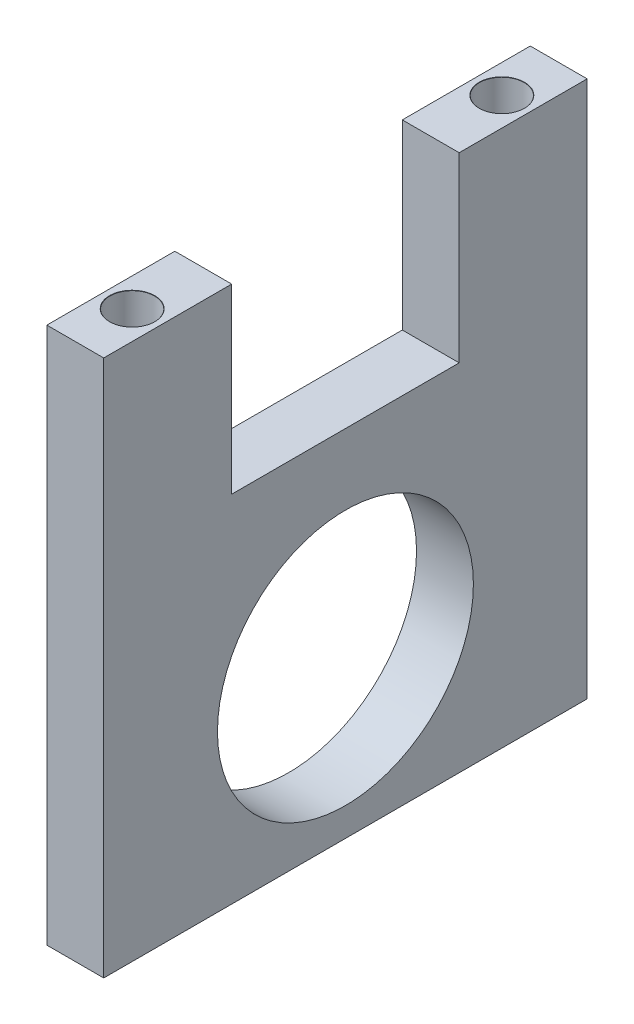
ISO-10303-21;
HEADER;
FILE_DESCRIPTION(('STEP AP214'),'2;1');
FILE_NAME('part.step','',(''),(''),'','','');
FILE_SCHEMA(('AUTOMOTIVE_DESIGN { 1 0 10303 214 1 1 1 1 }'));
ENDSEC;
DATA;
#1=APPLICATION_CONTEXT('core data for automotive mechanical design processes');
#2=APPLICATION_PROTOCOL_DEFINITION('international standard','automotive_design',2000,#1);
#3=PRODUCT_CONTEXT('',#1,'mechanical');
#4=PRODUCT('Part','Part','',(#3));
#5=PRODUCT_RELATED_PRODUCT_CATEGORY('part','',(#4));
#6=PRODUCT_DEFINITION_FORMATION('','',#4);
#7=PRODUCT_DEFINITION_CONTEXT('part definition',#1,'design');
#8=PRODUCT_DEFINITION('design','',#6,#7);
#9=PRODUCT_DEFINITION_SHAPE('','',#8);
#10=(LENGTH_UNIT() NAMED_UNIT(*) SI_UNIT(.MILLI.,.METRE.));
#11=(NAMED_UNIT(*) PLANE_ANGLE_UNIT() SI_UNIT($,.RADIAN.));
#12=(NAMED_UNIT(*) SI_UNIT($,.STERADIAN.) SOLID_ANGLE_UNIT());
#13=UNCERTAINTY_MEASURE_WITH_UNIT(LENGTH_MEASURE(1.E-05),#10,'distance_accuracy_value','');
#14=(GEOMETRIC_REPRESENTATION_CONTEXT(3) GLOBAL_UNCERTAINTY_ASSIGNED_CONTEXT((#13)) GLOBAL_UNIT_ASSIGNED_CONTEXT((#10,
#11,#12)) REPRESENTATION_CONTEXT('',''));
#15=CARTESIAN_POINT('',(0.,0.,0.));
#16=DIRECTION('',(0.,0.,1.));
#17=DIRECTION('',(1.,0.,0.));
#18=AXIS2_PLACEMENT_3D('',#15,#16,#17);
#19=CARTESIAN_POINT('',(163.908317581196,76.2,0.));
#20=DIRECTION('',(0.,-1.,0.));
#21=DIRECTION('',(0.,0.,-1.));
#22=AXIS2_PLACEMENT_3D('',#19,#20,#21);
#23=PLANE('',#22);
#24=DIRECTION('',(0.,0.,-1.));
#25=VECTOR('',#24,1.);
#26=CARTESIAN_POINT('',(170.258317581196,76.2,0.));
#27=LINE('',#26,#25);
#28=CARTESIAN_POINT('',(170.258317581196,76.2,-88.9));
#29=VERTEX_POINT('',#28);
#30=CARTESIAN_POINT('',(170.258317581196,76.2,-114.3));
#31=VERTEX_POINT('',#30);
#32=EDGE_CURVE('E242',#29,#31,#27,.T.);
#33=ORIENTED_EDGE('',*,*,#32,.T.);
#34=DIRECTION('',(1.,0.,0.));
#35=VECTOR('',#34,1.);
#36=CARTESIAN_POINT('',(163.908317581196,76.2,-114.3));
#37=LINE('',#36,#35);
#38=CARTESIAN_POINT('',(163.908317581196,76.2,-114.3));
#39=VERTEX_POINT('',#38);
#40=EDGE_CURVE('E11',#39,#31,#37,.T.);
#41=ORIENTED_EDGE('',*,*,#40,.F.);
#42=DIRECTION('',(0.,0.,-1.));
#43=VECTOR('',#42,1.);
#44=CARTESIAN_POINT('',(163.908317581196,76.2,0.));
#45=LINE('',#44,#43);
#46=CARTESIAN_POINT('',(163.908317581196,76.2,-88.9));
#47=VERTEX_POINT('',#46);
#48=EDGE_CURVE('E68',#47,#39,#45,.T.);
#49=ORIENTED_EDGE('',*,*,#48,.F.);
#50=DIRECTION('',(1.,0.,0.));
#51=VECTOR('',#50,1.);
#52=CARTESIAN_POINT('',(163.908317581196,76.2,-88.9));
#53=LINE('',#52,#51);
#54=EDGE_CURVE('E53',#47,#29,#53,.T.);
#55=ORIENTED_EDGE('',*,*,#54,.T.);
#56=EDGE_LOOP('',(#33,#41,#49,#55));
#57=FACE_BOUND('',#56,.T.);
#58=ADVANCED_FACE('F49',(#57),#23,.F.);
#59=CARTESIAN_POINT('',(163.908317581196,0.,-114.3));
#60=DIRECTION('',(0.,0.,1.));
#61=DIRECTION('',(1.,0.,0.));
#62=AXIS2_PLACEMENT_3D('',#59,#60,#61);
#63=PLANE('',#62);
#64=DIRECTION('',(0.,-1.,0.));
#65=VECTOR('',#64,1.);
#66=CARTESIAN_POINT('',(170.258317581196,0.,-114.3));
#67=LINE('',#66,#65);
#68=CARTESIAN_POINT('',(170.258317581196,96.52,-114.3));
#69=VERTEX_POINT('',#68);
#70=EDGE_CURVE('E157',#69,#31,#67,.T.);
#71=ORIENTED_EDGE('',*,*,#70,.F.);
#72=DIRECTION('',(1.,0.,0.));
#73=VECTOR('',#72,1.);
#74=CARTESIAN_POINT('',(163.908317581196,96.52,-114.3));
#75=LINE('',#74,#73);
#76=CARTESIAN_POINT('',(163.908317581196,96.52,-114.3));
#77=VERTEX_POINT('',#76);
#78=EDGE_CURVE('E59',#77,#69,#75,.T.);
#79=ORIENTED_EDGE('',*,*,#78,.F.);
#80=DIRECTION('',(0.,-1.,0.));
#81=VECTOR('',#80,1.);
#82=CARTESIAN_POINT('',(163.908317581196,0.,-114.3));
#83=LINE('',#82,#81);
#84=EDGE_CURVE('E142',#77,#39,#83,.T.);
#85=ORIENTED_EDGE('',*,*,#84,.T.);
#86=ORIENTED_EDGE('',*,*,#40,.T.);
#87=EDGE_LOOP('',(#71,#79,#85,#86));
#88=FACE_BOUND('',#87,.T.);
#89=ADVANCED_FACE('F181',(#88),#63,.T.);
#90=CARTESIAN_POINT('',(163.908317581196,96.52,0.));
#91=DIRECTION('',(0.,1.,0.));
#92=DIRECTION('',(0.,0.,1.));
#93=AXIS2_PLACEMENT_3D('',#90,#91,#92);
#94=PLANE('',#93);
#95=CARTESIAN_POINT('',(167.083317581196,96.52,-122.2375));
#96=DIRECTION('',(0.,1.,0.));
#97=DIRECTION('',(0.,0.,1.));
#98=AXIS2_PLACEMENT_3D('',#95,#96,#97);
#99=CIRCLE('',#98,2.525);
#100=CARTESIAN_POINT('',(167.083317581196,96.52,-119.7125));
#101=VERTEX_POINT('',#100);
#102=EDGE_CURVE('E174',#101,#101,#99,.T.);
#103=ORIENTED_EDGE('',*,*,#102,.F.);
#104=EDGE_LOOP('',(#103));
#105=FACE_BOUND('',#104,.T.);
#106=DIRECTION('',(0.,0.,1.));
#107=VECTOR('',#106,1.);
#108=CARTESIAN_POINT('',(170.258317581196,96.52,0.));
#109=LINE('',#108,#107);
#110=CARTESIAN_POINT('',(170.258317581196,96.52,-128.5875));
#111=VERTEX_POINT('',#110);
#112=EDGE_CURVE('E129',#111,#69,#109,.T.);
#113=ORIENTED_EDGE('',*,*,#112,.F.);
#114=DIRECTION('',(1.,0.,0.));
#115=VECTOR('',#114,1.);
#116=CARTESIAN_POINT('',(163.908317581196,96.52,-128.5875));
#117=LINE('',#116,#115);
#118=CARTESIAN_POINT('',(163.908317581196,96.52,-128.5875));
#119=VERTEX_POINT('',#118);
#120=EDGE_CURVE('E124',#119,#111,#117,.T.);
#121=ORIENTED_EDGE('',*,*,#120,.F.);
#122=DIRECTION('',(0.,0.,1.));
#123=VECTOR('',#122,1.);
#124=CARTESIAN_POINT('',(163.908317581196,96.52,0.));
#125=LINE('',#124,#123);
#126=EDGE_CURVE('E128',#119,#77,#125,.T.);
#127=ORIENTED_EDGE('',*,*,#126,.T.);
#128=ORIENTED_EDGE('',*,*,#78,.T.);
#129=EDGE_LOOP('',(#113,#121,#127,#128));
#130=FACE_BOUND('',#129,.T.);
#131=ADVANCED_FACE('F126',(#105,#130),#94,.T.);
#132=CARTESIAN_POINT('',(163.908317581196,0.,-128.5875));
#133=DIRECTION('',(0.,0.,1.));
#134=DIRECTION('',(1.,0.,0.));
#135=AXIS2_PLACEMENT_3D('',#132,#133,#134);
#136=PLANE('',#135);
#137=DIRECTION('',(0.,-1.,0.));
#138=VECTOR('',#137,1.);
#139=CARTESIAN_POINT('',(170.258317581196,0.,-128.5875));
#140=LINE('',#139,#138);
#141=CARTESIAN_POINT('',(170.258317581196,36.5632999999999,-128.5875));
#142=VERTEX_POINT('',#141);
#143=EDGE_CURVE('E218',#111,#142,#140,.T.);
#144=ORIENTED_EDGE('',*,*,#143,.T.);
#145=DIRECTION('',(1.,0.,0.));
#146=VECTOR('',#145,1.);
#147=CARTESIAN_POINT('',(163.908317581196,36.5632999999999,-128.5875));
#148=LINE('',#147,#146);
#149=CARTESIAN_POINT('',(163.908317581196,36.5632999999999,-128.5875));
#150=VERTEX_POINT('',#149);
#151=EDGE_CURVE('E132',#150,#142,#148,.T.);
#152=ORIENTED_EDGE('',*,*,#151,.F.);
#153=DIRECTION('',(0.,-1.,0.));
#154=VECTOR('',#153,1.);
#155=CARTESIAN_POINT('',(163.908317581196,0.,-128.5875));
#156=LINE('',#155,#154);
#157=EDGE_CURVE('E135',#119,#150,#156,.T.);
#158=ORIENTED_EDGE('',*,*,#157,.F.);
#159=ORIENTED_EDGE('',*,*,#120,.T.);
#160=EDGE_LOOP('',(#144,#152,#158,#159));
#161=FACE_BOUND('',#160,.T.);
#162=ADVANCED_FACE('F136',(#161),#136,.F.);
#163=CARTESIAN_POINT('',(163.908317581196,36.5632999999999,0.));
#164=DIRECTION('',(0.,1.,0.));
#165=DIRECTION('',(0.,0.,1.));
#166=AXIS2_PLACEMENT_3D('',#163,#164,#165);
#167=PLANE('',#166);
#168=DIRECTION('',(0.,0.,1.));
#169=VECTOR('',#168,1.);
#170=CARTESIAN_POINT('',(170.258317581196,36.5632999999999,0.));
#171=LINE('',#170,#169);
#172=CARTESIAN_POINT('',(170.258317581196,36.5632999999999,-74.6125));
#173=VERTEX_POINT('',#172);
#174=EDGE_CURVE('E214',#142,#173,#171,.T.);
#175=ORIENTED_EDGE('',*,*,#174,.T.);
#176=DIRECTION('',(1.,0.,0.));
#177=VECTOR('',#176,1.);
#178=CARTESIAN_POINT('',(163.908317581196,36.5632999999999,-74.6125));
#179=LINE('',#178,#177);
#180=CARTESIAN_POINT('',(163.908317581196,36.5632999999999,-74.6125));
#181=VERTEX_POINT('',#180);
#182=EDGE_CURVE('E216',#181,#173,#179,.T.);
#183=ORIENTED_EDGE('',*,*,#182,.F.);
#184=DIRECTION('',(0.,0.,1.));
#185=VECTOR('',#184,1.);
#186=CARTESIAN_POINT('',(163.908317581196,36.5632999999999,0.));
#187=LINE('',#186,#185);
#188=EDGE_CURVE('E139',#150,#181,#187,.T.);
#189=ORIENTED_EDGE('',*,*,#188,.F.);
#190=ORIENTED_EDGE('',*,*,#151,.T.);
#191=EDGE_LOOP('',(#175,#183,#189,#190));
#192=FACE_BOUND('',#191,.T.);
#193=ADVANCED_FACE('F189',(#192),#167,.F.);
#194=CARTESIAN_POINT('',(163.908317581196,0.,-74.6125));
#195=DIRECTION('',(0.,0.,1.));
#196=DIRECTION('',(1.,0.,0.));
#197=AXIS2_PLACEMENT_3D('',#194,#195,#196);
#198=PLANE('',#197);
#199=DIRECTION('',(0.,-1.,0.));
#200=VECTOR('',#199,1.);
#201=CARTESIAN_POINT('',(170.258317581196,0.,-74.6125));
#202=LINE('',#201,#200);
#203=CARTESIAN_POINT('',(170.258317581196,96.52,-74.6125));
#204=VERTEX_POINT('',#203);
#205=EDGE_CURVE('E219',#204,#173,#202,.T.);
#206=ORIENTED_EDGE('',*,*,#205,.F.);
#207=DIRECTION('',(1.,0.,0.));
#208=VECTOR('',#207,1.);
#209=CARTESIAN_POINT('',(163.908317581196,96.52,-74.6125));
#210=LINE('',#209,#208);
#211=CARTESIAN_POINT('',(163.908317581196,96.52,-74.6125));
#212=VERTEX_POINT('',#211);
#213=EDGE_CURVE('E239',#212,#204,#210,.T.);
#214=ORIENTED_EDGE('',*,*,#213,.F.);
#215=DIRECTION('',(0.,-1.,0.));
#216=VECTOR('',#215,1.);
#217=CARTESIAN_POINT('',(163.908317581196,0.,-74.6125));
#218=LINE('',#217,#216);
#219=EDGE_CURVE('E149',#212,#181,#218,.T.);
#220=ORIENTED_EDGE('',*,*,#219,.T.);
#221=ORIENTED_EDGE('',*,*,#182,.T.);
#222=EDGE_LOOP('',(#206,#214,#220,#221));
#223=FACE_BOUND('',#222,.T.);
#224=ADVANCED_FACE('F193',(#223),#198,.T.);
#225=CARTESIAN_POINT('',(167.083317581196,96.52,-80.9625));
#226=DIRECTION('',(0.,1.,0.));
#227=DIRECTION('',(0.,0.,1.));
#228=AXIS2_PLACEMENT_3D('',#225,#226,#227);
#229=CIRCLE('',#228,2.525);
#230=CARTESIAN_POINT('',(167.083317581196,96.52,-78.4375));
#231=VERTEX_POINT('',#230);
#232=EDGE_CURVE('E165',#231,#231,#229,.T.);
#233=ORIENTED_EDGE('',*,*,#232,.F.);
#234=EDGE_LOOP('',(#233));
#235=FACE_BOUND('',#234,.T.);
#236=CARTESIAN_POINT('',(170.258317581196,96.52,-88.9));
#237=VERTEX_POINT('',#236);
#238=EDGE_CURVE('E227',#237,#204,#109,.T.);
#239=ORIENTED_EDGE('',*,*,#238,.F.);
#240=DIRECTION('',(1.,0.,0.));
#241=VECTOR('',#240,1.);
#242=CARTESIAN_POINT('',(163.908317581196,96.52,-88.9));
#243=LINE('',#242,#241);
#244=CARTESIAN_POINT('',(163.908317581196,96.52,-88.9));
#245=VERTEX_POINT('',#244);
#246=EDGE_CURVE('E240',#245,#237,#243,.T.);
#247=ORIENTED_EDGE('',*,*,#246,.F.);
#248=EDGE_CURVE('E144',#245,#212,#125,.T.);
#249=ORIENTED_EDGE('',*,*,#248,.T.);
#250=ORIENTED_EDGE('',*,*,#213,.T.);
#251=EDGE_LOOP('',(#239,#247,#249,#250));
#252=FACE_BOUND('',#251,.T.);
#253=ADVANCED_FACE('F183',(#235,#252),#94,.T.);
#254=CARTESIAN_POINT('',(163.908317581196,54.0257999999999,-101.6));
#255=DIRECTION('',(1.,0.,0.));
#256=DIRECTION('',(0.,0.,-1.));
#257=AXIS2_PLACEMENT_3D('',#254,#255,#256);
#258=CYLINDRICAL_SURFACE('',#257,14.2875);
#259=CARTESIAN_POINT('',(163.908317581196,54.0257999999999,-101.6));
#260=DIRECTION('',(1.,0.,0.));
#261=DIRECTION('',(0.,0.,-1.));
#262=AXIS2_PLACEMENT_3D('',#259,#260,#261);
#263=CIRCLE('',#262,14.2875);
#264=CARTESIAN_POINT('',(163.908317581196,54.0257999999999,-115.8875));
#265=VERTEX_POINT('',#264);
#266=EDGE_CURVE('E152',#265,#265,#263,.T.);
#267=ORIENTED_EDGE('',*,*,#266,.F.);
#268=EDGE_LOOP('',(#267));
#269=FACE_BOUND('',#268,.T.);
#270=CARTESIAN_POINT('',(170.258317581196,54.0257999999999,-101.6));
#271=DIRECTION('',(1.,0.,0.));
#272=DIRECTION('',(0.,0.,-1.));
#273=AXIS2_PLACEMENT_3D('',#270,#271,#272);
#274=CIRCLE('',#273,14.2875);
#275=CARTESIAN_POINT('',(170.258317581196,54.0257999999999,-115.8875));
#276=VERTEX_POINT('',#275);
#277=EDGE_CURVE('E161',#276,#276,#274,.T.);
#278=ORIENTED_EDGE('',*,*,#277,.T.);
#279=EDGE_LOOP('',(#278));
#280=FACE_BOUND('',#279,.T.);
#281=ADVANCED_FACE('F51',(#269,#280),#258,.F.);
#282=CARTESIAN_POINT('',(163.908317581196,0.,-88.9));
#283=DIRECTION('',(0.,0.,1.));
#284=DIRECTION('',(1.,0.,0.));
#285=AXIS2_PLACEMENT_3D('',#282,#283,#284);
#286=PLANE('',#285);
#287=DIRECTION('',(0.,-1.,0.));
#288=VECTOR('',#287,1.);
#289=CARTESIAN_POINT('',(170.258317581196,0.,-88.9));
#290=LINE('',#289,#288);
#291=EDGE_CURVE('E229',#237,#29,#290,.T.);
#292=ORIENTED_EDGE('',*,*,#291,.T.);
#293=ORIENTED_EDGE('',*,*,#54,.F.);
#294=DIRECTION('',(0.,-1.,0.));
#295=VECTOR('',#294,1.);
#296=CARTESIAN_POINT('',(163.908317581196,0.,-88.9));
#297=LINE('',#296,#295);
#298=EDGE_CURVE('E108',#245,#47,#297,.T.);
#299=ORIENTED_EDGE('',*,*,#298,.F.);
#300=ORIENTED_EDGE('',*,*,#246,.T.);
#301=EDGE_LOOP('',(#292,#293,#299,#300));
#302=FACE_BOUND('',#301,.T.);
#303=ADVANCED_FACE('F201',(#302),#286,.F.);
#304=CARTESIAN_POINT('',(163.908317581196,0.,0.));
#305=DIRECTION('',(1.,0.,0.));
#306=DIRECTION('',(0.,0.,-1.));
#307=AXIS2_PLACEMENT_3D('',#304,#305,#306);
#308=PLANE('',#307);
#309=ORIENTED_EDGE('',*,*,#266,.T.);
#310=EDGE_LOOP('',(#309));
#311=FACE_BOUND('',#310,.T.);
#312=ORIENTED_EDGE('',*,*,#48,.T.);
#313=ORIENTED_EDGE('',*,*,#84,.F.);
#314=ORIENTED_EDGE('',*,*,#126,.F.);
#315=ORIENTED_EDGE('',*,*,#157,.T.);
#316=ORIENTED_EDGE('',*,*,#188,.T.);
#317=ORIENTED_EDGE('',*,*,#219,.F.);
#318=ORIENTED_EDGE('',*,*,#248,.F.);
#319=ORIENTED_EDGE('',*,*,#298,.T.);
#320=EDGE_LOOP('',(#312,#313,#314,#315,#316,#317,#318,#319));
#321=FACE_BOUND('',#320,.T.);
#322=ADVANCED_FACE('F141',(#311,#321),#308,.F.);
#323=CARTESIAN_POINT('',(170.258317581196,0.,0.));
#324=DIRECTION('',(1.,0.,0.));
#325=DIRECTION('',(0.,0.,-1.));
#326=AXIS2_PLACEMENT_3D('',#323,#324,#325);
#327=PLANE('',#326);
#328=ORIENTED_EDGE('',*,*,#277,.F.);
#329=EDGE_LOOP('',(#328));
#330=FACE_BOUND('',#329,.T.);
#331=ORIENTED_EDGE('',*,*,#32,.F.);
#332=ORIENTED_EDGE('',*,*,#291,.F.);
#333=ORIENTED_EDGE('',*,*,#238,.T.);
#334=ORIENTED_EDGE('',*,*,#205,.T.);
#335=ORIENTED_EDGE('',*,*,#174,.F.);
#336=ORIENTED_EDGE('',*,*,#143,.F.);
#337=ORIENTED_EDGE('',*,*,#112,.T.);
#338=ORIENTED_EDGE('',*,*,#70,.T.);
#339=EDGE_LOOP('',(#331,#332,#333,#334,#335,#336,#337,#338));
#340=FACE_BOUND('',#339,.T.);
#341=ADVANCED_FACE('F224',(#330,#340),#327,.T.);
#342=CARTESIAN_POINT('',(167.083317581196,71.12,-80.9625));
#343=DIRECTION('',(0.,1.,0.));
#344=DIRECTION('',(0.,0.,1.));
#345=AXIS2_PLACEMENT_3D('',#342,#343,#344);
#346=CONICAL_SURFACE('',#345,2.5,1.02974425867665);
#347=CARTESIAN_POINT('',(167.083317581196,69.6178484524311,-80.9625));
#348=VERTEX_POINT('',#347);
#349=VERTEX_LOOP('',#348);
#350=FACE_BOUND('',#349,.T.);
#351=CARTESIAN_POINT('',(167.083317581196,71.12,-80.9625));
#352=DIRECTION('',(0.,1.,0.));
#353=DIRECTION('',(0.,0.,1.));
#354=AXIS2_PLACEMENT_3D('',#351,#352,#353);
#355=CIRCLE('',#354,2.5);
#356=CARTESIAN_POINT('',(167.083317581196,71.12,-78.4625));
#357=VERTEX_POINT('',#356);
#358=EDGE_CURVE('E158',#357,#357,#355,.T.);
#359=ORIENTED_EDGE('',*,*,#358,.T.);
#360=EDGE_LOOP('',(#359));
#361=FACE_BOUND('',#360,.T.);
#362=ADVANCED_FACE('F251',(#350,#361),#346,.F.);
#363=CARTESIAN_POINT('',(167.083317581196,96.52,-80.9625));
#364=DIRECTION('',(0.,1.,0.));
#365=DIRECTION('',(0.,0.,1.));
#366=AXIS2_PLACEMENT_3D('',#363,#364,#365);
#367=CYLINDRICAL_SURFACE('',#366,2.5);
#368=ORIENTED_EDGE('',*,*,#358,.F.);
#369=EDGE_LOOP('',(#368));
#370=FACE_BOUND('',#369,.T.);
#371=CARTESIAN_POINT('',(167.083317581196,96.495,-80.9625));
#372=DIRECTION('',(0.,1.,0.));
#373=DIRECTION('',(0.,0.,1.));
#374=AXIS2_PLACEMENT_3D('',#371,#372,#373);
#375=CIRCLE('',#374,2.5);
#376=CARTESIAN_POINT('',(167.083317581196,96.495,-78.4625));
#377=VERTEX_POINT('',#376);
#378=EDGE_CURVE('E162',#377,#377,#375,.T.);
#379=ORIENTED_EDGE('',*,*,#378,.T.);
#380=EDGE_LOOP('',(#379));
#381=FACE_BOUND('',#380,.T.);
#382=ADVANCED_FACE('F254',(#370,#381),#367,.F.);
#383=CARTESIAN_POINT('',(167.083317581196,96.52,-80.9625));
#384=DIRECTION('',(0.,1.,0.));
#385=DIRECTION('',(0.,0.,1.));
#386=AXIS2_PLACEMENT_3D('',#383,#384,#385);
#387=CONICAL_SURFACE('',#386,2.525,0.785398163397171);
#388=ORIENTED_EDGE('',*,*,#378,.F.);
#389=EDGE_LOOP('',(#388));
#390=FACE_BOUND('',#389,.T.);
#391=ORIENTED_EDGE('',*,*,#232,.T.);
#392=EDGE_LOOP('',(#391));
#393=FACE_BOUND('',#392,.T.);
#394=ADVANCED_FACE('F263',(#390,#393),#387,.F.);
#395=CARTESIAN_POINT('',(167.083317581196,71.12,-122.2375));
#396=DIRECTION('',(0.,1.,0.));
#397=DIRECTION('',(0.,0.,1.));
#398=AXIS2_PLACEMENT_3D('',#395,#396,#397);
#399=CONICAL_SURFACE('',#398,2.5,1.02974425867665);
#400=CARTESIAN_POINT('',(167.083317581196,69.6178484524311,-122.2375));
#401=VERTEX_POINT('',#400);
#402=VERTEX_LOOP('',#401);
#403=FACE_BOUND('',#402,.T.);
#404=CARTESIAN_POINT('',(167.083317581196,71.12,-122.2375));
#405=DIRECTION('',(0.,1.,0.));
#406=DIRECTION('',(0.,0.,1.));
#407=AXIS2_PLACEMENT_3D('',#404,#405,#406);
#408=CIRCLE('',#407,2.5);
#409=CARTESIAN_POINT('',(167.083317581196,71.12,-119.7375));
#410=VERTEX_POINT('',#409);
#411=EDGE_CURVE('E168',#410,#410,#408,.T.);
#412=ORIENTED_EDGE('',*,*,#411,.T.);
#413=EDGE_LOOP('',(#412));
#414=FACE_BOUND('',#413,.T.);
#415=ADVANCED_FACE('F267',(#403,#414),#399,.F.);
#416=CARTESIAN_POINT('',(167.083317581196,96.52,-122.2375));
#417=DIRECTION('',(0.,1.,0.));
#418=DIRECTION('',(0.,0.,1.));
#419=AXIS2_PLACEMENT_3D('',#416,#417,#418);
#420=CYLINDRICAL_SURFACE('',#419,2.5);
#421=ORIENTED_EDGE('',*,*,#411,.F.);
#422=EDGE_LOOP('',(#421));
#423=FACE_BOUND('',#422,.T.);
#424=CARTESIAN_POINT('',(167.083317581196,96.495,-122.2375));
#425=DIRECTION('',(0.,1.,0.));
#426=DIRECTION('',(0.,0.,1.));
#427=AXIS2_PLACEMENT_3D('',#424,#425,#426);
#428=CIRCLE('',#427,2.5);
#429=CARTESIAN_POINT('',(167.083317581196,96.495,-119.7375));
#430=VERTEX_POINT('',#429);
#431=EDGE_CURVE('E171',#430,#430,#428,.T.);
#432=ORIENTED_EDGE('',*,*,#431,.T.);
#433=EDGE_LOOP('',(#432));
#434=FACE_BOUND('',#433,.T.);
#435=ADVANCED_FACE('F271',(#423,#434),#420,.F.);
#436=CARTESIAN_POINT('',(167.083317581196,96.52,-122.2375));
#437=DIRECTION('',(0.,1.,0.));
#438=DIRECTION('',(0.,0.,1.));
#439=AXIS2_PLACEMENT_3D('',#436,#437,#438);
#440=CONICAL_SURFACE('',#439,2.525,0.785398163397171);
#441=ORIENTED_EDGE('',*,*,#431,.F.);
#442=EDGE_LOOP('',(#441));
#443=FACE_BOUND('',#442,.T.);
#444=ORIENTED_EDGE('',*,*,#102,.T.);
#445=EDGE_LOOP('',(#444));
#446=FACE_BOUND('',#445,.T.);
#447=ADVANCED_FACE('F178',(#443,#446),#440,.F.);
#448=CLOSED_SHELL('',(#58,#89,#131,#162,#193,#224,#253,#281,#303,#322,#341,#362,#382,#394,#415,
#435,#447));
#449=MANIFOLD_SOLID_BREP('B2',#448);
#450=ADVANCED_BREP_SHAPE_REPRESENTATION('',(#18,#449),#14);
#451=SHAPE_DEFINITION_REPRESENTATION(#9,#450);
ENDSEC;
END-ISO-10303-21;
